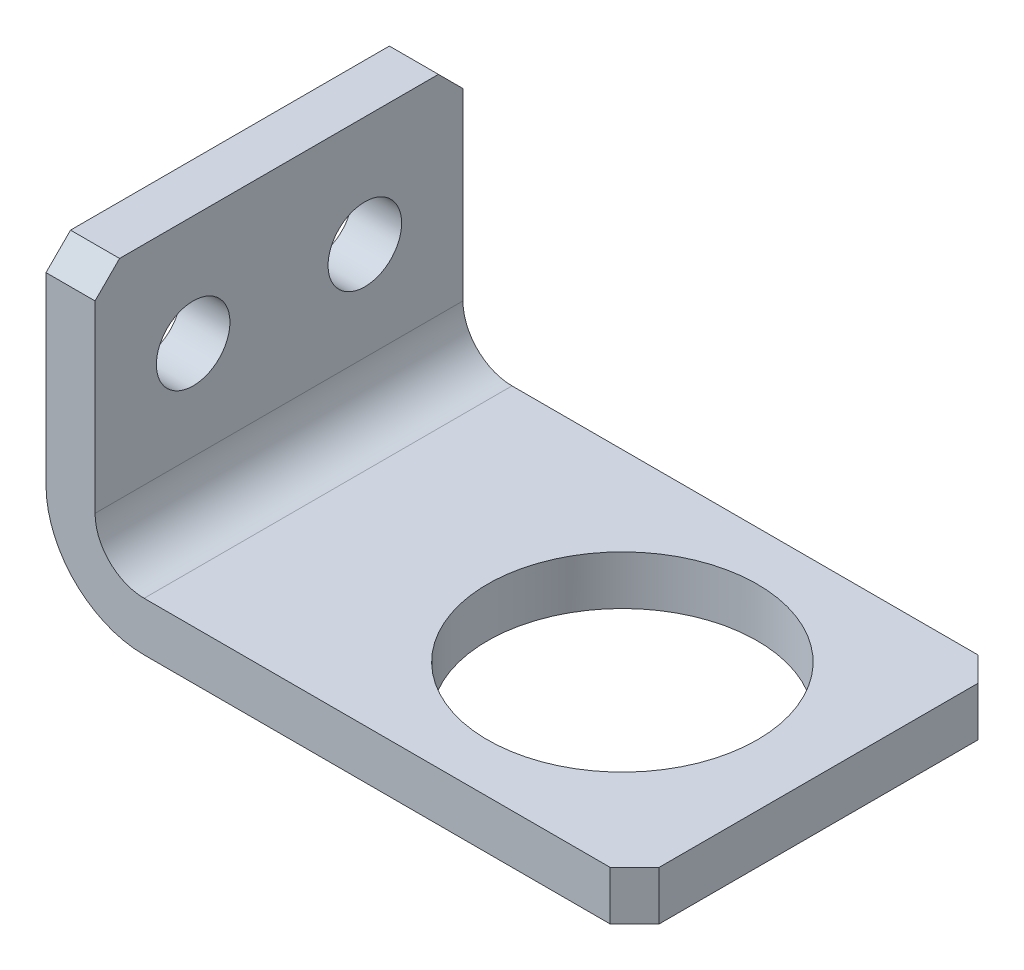
ISO-10303-21;
HEADER;
FILE_DESCRIPTION(('STEP AP214'),'2;1');
FILE_NAME('part.step','',(''),(''),'','','');
FILE_SCHEMA(('AUTOMOTIVE_DESIGN { 1 0 10303 214 1 1 1 1 }'));
ENDSEC;
DATA;
#1=APPLICATION_CONTEXT('core data for automotive mechanical design processes');
#2=APPLICATION_PROTOCOL_DEFINITION('international standard','automotive_design',2000,#1);
#3=PRODUCT_CONTEXT('',#1,'mechanical');
#4=PRODUCT('Part','Part','',(#3));
#5=PRODUCT_RELATED_PRODUCT_CATEGORY('part','',(#4));
#6=PRODUCT_DEFINITION_FORMATION('','',#4);
#7=PRODUCT_DEFINITION_CONTEXT('part definition',#1,'design');
#8=PRODUCT_DEFINITION('design','',#6,#7);
#9=PRODUCT_DEFINITION_SHAPE('','',#8);
#10=(LENGTH_UNIT() NAMED_UNIT(*) SI_UNIT(.MILLI.,.METRE.));
#11=(NAMED_UNIT(*) PLANE_ANGLE_UNIT() SI_UNIT($,.RADIAN.));
#12=(NAMED_UNIT(*) SI_UNIT($,.STERADIAN.) SOLID_ANGLE_UNIT());
#13=UNCERTAINTY_MEASURE_WITH_UNIT(LENGTH_MEASURE(1.E-05),#10,'distance_accuracy_value','');
#14=(GEOMETRIC_REPRESENTATION_CONTEXT(3) GLOBAL_UNCERTAINTY_ASSIGNED_CONTEXT((#13)) GLOBAL_UNIT_ASSIGNED_CONTEXT((#10,
#11,#12)) REPRESENTATION_CONTEXT('',''));
#15=CARTESIAN_POINT('',(0.,0.,0.));
#16=DIRECTION('',(0.,0.,1.));
#17=DIRECTION('',(1.,0.,0.));
#18=AXIS2_PLACEMENT_3D('',#15,#16,#17);
#19=CARTESIAN_POINT('',(0.,25.,13.));
#20=DIRECTION('',(0.,0.707106781186547,0.707106781186548));
#21=DIRECTION('',(-1.,0.,0.));
#22=AXIS2_PLACEMENT_3D('',#19,#20,#21);
#23=PLANE('',#22);
#24=DIRECTION('',(1.,0.,0.));
#25=VECTOR('',#24,1.);
#26=CARTESIAN_POINT('',(-24.,25.,13.));
#27=LINE('',#26,#25);
#28=CARTESIAN_POINT('',(-24.,25.,13.));
#29=VERTEX_POINT('',#28);
#30=CARTESIAN_POINT('',(-20.,25.,13.));
#31=VERTEX_POINT('',#30);
#32=EDGE_CURVE('E269',#29,#31,#27,.T.);
#33=ORIENTED_EDGE('',*,*,#32,.F.);
#34=DIRECTION('',(0.,0.707106781186548,-0.707106781186547));
#35=VECTOR('',#34,1.);
#36=CARTESIAN_POINT('',(-24.,25.,13.));
#37=LINE('',#36,#35);
#38=CARTESIAN_POINT('',(-24.,23.,15.));
#39=VERTEX_POINT('',#38);
#40=EDGE_CURVE('E79',#39,#29,#37,.T.);
#41=ORIENTED_EDGE('',*,*,#40,.F.);
#42=DIRECTION('',(-1.,0.,0.));
#43=VECTOR('',#42,1.);
#44=CARTESIAN_POINT('',(-24.,23.,15.));
#45=LINE('',#44,#43);
#46=CARTESIAN_POINT('',(-20.,23.,15.));
#47=VERTEX_POINT('',#46);
#48=EDGE_CURVE('E272',#47,#39,#45,.T.);
#49=ORIENTED_EDGE('',*,*,#48,.F.);
#50=DIRECTION('',(0.,-0.707106781186548,0.707106781186547));
#51=VECTOR('',#50,1.);
#52=CARTESIAN_POINT('',(-20.,26.5,11.5));
#53=LINE('',#52,#51);
#54=EDGE_CURVE('E13',#31,#47,#53,.T.);
#55=ORIENTED_EDGE('',*,*,#54,.F.);
#56=EDGE_LOOP('',(#33,#41,#49,#55));
#57=FACE_BOUND('',#56,.T.);
#58=ADVANCED_FACE('F71',(#57),#23,.T.);
#59=CARTESIAN_POINT('',(0.,25.,-13.));
#60=DIRECTION('',(0.,0.707106781186548,-0.707106781186547));
#61=DIRECTION('',(1.,0.,0.));
#62=AXIS2_PLACEMENT_3D('',#59,#60,#61);
#63=PLANE('',#62);
#64=DIRECTION('',(-1.,0.,0.));
#65=VECTOR('',#64,1.);
#66=CARTESIAN_POINT('',(-20.,25.,-13.));
#67=LINE('',#66,#65);
#68=CARTESIAN_POINT('',(-20.,25.,-13.));
#69=VERTEX_POINT('',#68);
#70=CARTESIAN_POINT('',(-24.,25.,-13.));
#71=VERTEX_POINT('',#70);
#72=EDGE_CURVE('E261',#69,#71,#67,.T.);
#73=ORIENTED_EDGE('',*,*,#72,.F.);
#74=DIRECTION('',(0.,0.707106781186547,0.707106781186548));
#75=VECTOR('',#74,1.);
#76=CARTESIAN_POINT('',(-20.,11.5,-26.5));
#77=LINE('',#76,#75);
#78=CARTESIAN_POINT('',(-20.,23.,-15.));
#79=VERTEX_POINT('',#78);
#80=EDGE_CURVE('E266',#79,#69,#77,.T.);
#81=ORIENTED_EDGE('',*,*,#80,.F.);
#82=DIRECTION('',(1.,0.,0.));
#83=VECTOR('',#82,1.);
#84=CARTESIAN_POINT('',(-20.,23.,-15.));
#85=LINE('',#84,#83);
#86=CARTESIAN_POINT('',(-24.,23.,-15.));
#87=VERTEX_POINT('',#86);
#88=EDGE_CURVE('E264',#87,#79,#85,.T.);
#89=ORIENTED_EDGE('',*,*,#88,.F.);
#90=DIRECTION('',(0.,-0.707106781186547,-0.707106781186548));
#91=VECTOR('',#90,1.);
#92=CARTESIAN_POINT('',(-24.,25.,-13.));
#93=LINE('',#92,#91);
#94=EDGE_CURVE('E165',#71,#87,#93,.T.);
#95=ORIENTED_EDGE('',*,*,#94,.F.);
#96=EDGE_LOOP('',(#73,#81,#89,#95));
#97=FACE_BOUND('',#96,.T.);
#98=ADVANCED_FACE('F278',(#97),#63,.T.);
#99=CARTESIAN_POINT('',(24.,25.,13.));
#100=DIRECTION('',(-0.707106781186547,0.,-0.707106781186547));
#101=DIRECTION('',(0.,-1.,0.));
#102=AXIS2_PLACEMENT_3D('',#99,#100,#101);
#103=PLANE('',#102);
#104=DIRECTION('',(0.,-1.,0.));
#105=VECTOR('',#104,1.);
#106=CARTESIAN_POINT('',(24.,25.,13.));
#107=LINE('',#106,#105);
#108=CARTESIAN_POINT('',(24.,4.,13.));
#109=VERTEX_POINT('',#108);
#110=CARTESIAN_POINT('',(24.,0.,13.));
#111=VERTEX_POINT('',#110);
#112=EDGE_CURVE('E251',#109,#111,#107,.T.);
#113=ORIENTED_EDGE('',*,*,#112,.F.);
#114=DIRECTION('',(-0.707106781186548,0.,0.707106781186548));
#115=VECTOR('',#114,1.);
#116=CARTESIAN_POINT('',(24.,4.,13.));
#117=LINE('',#116,#115);
#118=CARTESIAN_POINT('',(22.,4.,15.));
#119=VERTEX_POINT('',#118);
#120=EDGE_CURVE('E257',#119,#109,#117,.F.);
#121=ORIENTED_EDGE('',*,*,#120,.F.);
#122=DIRECTION('',(0.,1.,0.));
#123=VECTOR('',#122,1.);
#124=CARTESIAN_POINT('',(22.,25.,15.));
#125=LINE('',#124,#123);
#126=CARTESIAN_POINT('',(22.,0.,15.));
#127=VERTEX_POINT('',#126);
#128=EDGE_CURVE('E254',#127,#119,#125,.T.);
#129=ORIENTED_EDGE('',*,*,#128,.F.);
#130=DIRECTION('',(0.707106781186548,0.,-0.707106781186548));
#131=VECTOR('',#130,1.);
#132=CARTESIAN_POINT('',(24.,0.,13.));
#133=LINE('',#132,#131);
#134=EDGE_CURVE('E259',#111,#127,#133,.F.);
#135=ORIENTED_EDGE('',*,*,#134,.F.);
#136=EDGE_LOOP('',(#113,#121,#129,#135));
#137=FACE_BOUND('',#136,.T.);
#138=ADVANCED_FACE('F304',(#137),#103,.F.);
#139=CARTESIAN_POINT('',(24.,25.,-13.));
#140=DIRECTION('',(-0.707106781186547,0.,0.707106781186548));
#141=DIRECTION('',(0.,1.,0.));
#142=AXIS2_PLACEMENT_3D('',#139,#140,#141);
#143=PLANE('',#142);
#144=DIRECTION('',(0.,1.,0.));
#145=VECTOR('',#144,1.);
#146=CARTESIAN_POINT('',(24.,25.,-13.));
#147=LINE('',#146,#145);
#148=CARTESIAN_POINT('',(24.,0.,-13.));
#149=VERTEX_POINT('',#148);
#150=CARTESIAN_POINT('',(24.,4.,-13.));
#151=VERTEX_POINT('',#150);
#152=EDGE_CURVE('E231',#149,#151,#147,.T.);
#153=ORIENTED_EDGE('',*,*,#152,.F.);
#154=DIRECTION('',(-0.707106781186548,0.,-0.707106781186547));
#155=VECTOR('',#154,1.);
#156=CARTESIAN_POINT('',(24.,0.,-13.));
#157=LINE('',#156,#155);
#158=CARTESIAN_POINT('',(22.,0.,-15.));
#159=VERTEX_POINT('',#158);
#160=EDGE_CURVE('E246',#159,#149,#157,.F.);
#161=ORIENTED_EDGE('',*,*,#160,.F.);
#162=DIRECTION('',(0.,-1.,0.));
#163=VECTOR('',#162,1.);
#164=CARTESIAN_POINT('',(22.,25.,-15.));
#165=LINE('',#164,#163);
#166=CARTESIAN_POINT('',(22.,4.,-15.));
#167=VERTEX_POINT('',#166);
#168=EDGE_CURVE('E244',#167,#159,#165,.T.);
#169=ORIENTED_EDGE('',*,*,#168,.F.);
#170=DIRECTION('',(0.707106781186548,0.,0.707106781186547));
#171=VECTOR('',#170,1.);
#172=CARTESIAN_POINT('',(24.,4.,-13.));
#173=LINE('',#172,#171);
#174=EDGE_CURVE('E249',#151,#167,#173,.F.);
#175=ORIENTED_EDGE('',*,*,#174,.F.);
#176=EDGE_LOOP('',(#153,#161,#169,#175));
#177=FACE_BOUND('',#176,.T.);
#178=ADVANCED_FACE('F293',(#177),#143,.F.);
#179=CARTESIAN_POINT('',(-24.,25.,15.));
#180=DIRECTION('',(1.,0.,0.));
#181=DIRECTION('',(0.,0.,-1.));
#182=AXIS2_PLACEMENT_3D('',#179,#180,#181);
#183=PLANE('',#182);
#184=CARTESIAN_POINT('',(-24.,16.,7.));
#185=DIRECTION('',(1.,0.,0.));
#186=DIRECTION('',(0.,0.,-1.));
#187=AXIS2_PLACEMENT_3D('',#184,#185,#186);
#188=CIRCLE('',#187,3.);
#189=CARTESIAN_POINT('',(-24.,16.,4.));
#190=VERTEX_POINT('',#189);
#191=EDGE_CURVE('E191',#190,#190,#188,.T.);
#192=ORIENTED_EDGE('',*,*,#191,.T.);
#193=EDGE_LOOP('',(#192));
#194=FACE_BOUND('',#193,.T.);
#195=DIRECTION('',(0.,-1.,0.));
#196=VECTOR('',#195,1.);
#197=CARTESIAN_POINT('',(-24.,25.,15.));
#198=LINE('',#197,#196);
#199=CARTESIAN_POINT('',(-24.,8.,15.));
#200=VERTEX_POINT('',#199);
#201=EDGE_CURVE('E170',#39,#200,#198,.T.);
#202=ORIENTED_EDGE('',*,*,#201,.F.);
#203=ORIENTED_EDGE('',*,*,#40,.T.);
#204=DIRECTION('',(0.,0.,1.));
#205=VECTOR('',#204,1.);
#206=CARTESIAN_POINT('',(-24.,25.,15.));
#207=LINE('',#206,#205);
#208=EDGE_CURVE('E171',#71,#29,#207,.T.);
#209=ORIENTED_EDGE('',*,*,#208,.F.);
#210=ORIENTED_EDGE('',*,*,#94,.T.);
#211=DIRECTION('',(0.,-1.,0.));
#212=VECTOR('',#211,1.);
#213=CARTESIAN_POINT('',(-24.,25.,-15.));
#214=LINE('',#213,#212);
#215=CARTESIAN_POINT('',(-24.,8.,-15.));
#216=VERTEX_POINT('',#215);
#217=EDGE_CURVE('E158',#87,#216,#214,.T.);
#218=ORIENTED_EDGE('',*,*,#217,.T.);
#219=DIRECTION('',(0.,0.,1.));
#220=VECTOR('',#219,1.);
#221=CARTESIAN_POINT('',(-24.,8.,-15.));
#222=LINE('',#221,#220);
#223=EDGE_CURVE('E163',#216,#200,#222,.T.);
#224=ORIENTED_EDGE('',*,*,#223,.T.);
#225=EDGE_LOOP('',(#202,#203,#209,#210,#218,#224));
#226=FACE_BOUND('',#225,.T.);
#227=CARTESIAN_POINT('',(-24.,16.,-7.));
#228=DIRECTION('',(-1.,0.,0.));
#229=DIRECTION('',(0.,0.,1.));
#230=AXIS2_PLACEMENT_3D('',#227,#228,#229);
#231=CIRCLE('',#230,3.);
#232=CARTESIAN_POINT('',(-24.,16.,-4.));
#233=VERTEX_POINT('',#232);
#234=EDGE_CURVE('E235',#233,#233,#231,.T.);
#235=ORIENTED_EDGE('',*,*,#234,.F.);
#236=EDGE_LOOP('',(#235));
#237=FACE_BOUND('',#236,.T.);
#238=ADVANCED_FACE('F161',(#194,#226,#237),#183,.F.);
#239=CARTESIAN_POINT('',(-20.,0.,-15.));
#240=DIRECTION('',(1.,0.,0.));
#241=DIRECTION('',(0.,0.,-1.));
#242=AXIS2_PLACEMENT_3D('',#239,#240,#241);
#243=PLANE('',#242);
#244=DIRECTION('',(0.,0.,1.));
#245=VECTOR('',#244,1.);
#246=CARTESIAN_POINT('',(-20.,25.,-15.));
#247=LINE('',#246,#245);
#248=EDGE_CURVE('E214',#69,#31,#247,.T.);
#249=ORIENTED_EDGE('',*,*,#248,.T.);
#250=ORIENTED_EDGE('',*,*,#54,.T.);
#251=DIRECTION('',(0.,1.,0.));
#252=VECTOR('',#251,1.);
#253=CARTESIAN_POINT('',(-20.,0.,15.));
#254=LINE('',#253,#252);
#255=CARTESIAN_POINT('',(-20.,8.,15.));
#256=VERTEX_POINT('',#255);
#257=EDGE_CURVE('E194',#256,#47,#254,.T.);
#258=ORIENTED_EDGE('',*,*,#257,.F.);
#259=DIRECTION('',(0.,0.,1.));
#260=VECTOR('',#259,1.);
#261=CARTESIAN_POINT('',(-20.,8.,-15.));
#262=LINE('',#261,#260);
#263=CARTESIAN_POINT('',(-20.,8.,-15.));
#264=VERTEX_POINT('',#263);
#265=EDGE_CURVE('E206',#264,#256,#262,.T.);
#266=ORIENTED_EDGE('',*,*,#265,.F.);
#267=DIRECTION('',(0.,1.,0.));
#268=VECTOR('',#267,1.);
#269=CARTESIAN_POINT('',(-20.,0.,-15.));
#270=LINE('',#269,#268);
#271=EDGE_CURVE('E196',#264,#79,#270,.T.);
#272=ORIENTED_EDGE('',*,*,#271,.T.);
#273=ORIENTED_EDGE('',*,*,#80,.T.);
#274=EDGE_LOOP('',(#249,#250,#258,#266,#272,#273));
#275=FACE_BOUND('',#274,.T.);
#276=CARTESIAN_POINT('',(-20.,16.,7.));
#277=DIRECTION('',(1.,0.,0.));
#278=DIRECTION('',(0.,0.,-1.));
#279=AXIS2_PLACEMENT_3D('',#276,#277,#278);
#280=CIRCLE('',#279,3.);
#281=CARTESIAN_POINT('',(-20.,16.,4.));
#282=VERTEX_POINT('',#281);
#283=EDGE_CURVE('E232',#282,#282,#280,.T.);
#284=ORIENTED_EDGE('',*,*,#283,.F.);
#285=EDGE_LOOP('',(#284));
#286=FACE_BOUND('',#285,.T.);
#287=CARTESIAN_POINT('',(-20.,16.,-7.));
#288=DIRECTION('',(1.,0.,0.));
#289=DIRECTION('',(0.,0.,-1.));
#290=AXIS2_PLACEMENT_3D('',#287,#288,#289);
#291=CIRCLE('',#290,3.);
#292=CARTESIAN_POINT('',(-20.,16.,-10.));
#293=VERTEX_POINT('',#292);
#294=EDGE_CURVE('E188',#293,#293,#291,.F.);
#295=ORIENTED_EDGE('',*,*,#294,.T.);
#296=EDGE_LOOP('',(#295));
#297=FACE_BOUND('',#296,.T.);
#298=ADVANCED_FACE('F280',(#275,#286,#297),#243,.T.);
#299=CARTESIAN_POINT('',(24.,25.,15.));
#300=DIRECTION('',(0.,0.,-1.));
#301=DIRECTION('',(-1.,0.,0.));
#302=AXIS2_PLACEMENT_3D('',#299,#300,#301);
#303=PLANE('',#302);
#304=ORIENTED_EDGE('',*,*,#257,.T.);
#305=ORIENTED_EDGE('',*,*,#48,.T.);
#306=ORIENTED_EDGE('',*,*,#201,.T.);
#307=CARTESIAN_POINT('',(-16.,8.,15.));
#308=DIRECTION('',(0.,0.,1.));
#309=DIRECTION('',(1.,0.,0.));
#310=AXIS2_PLACEMENT_3D('',#307,#308,#309);
#311=CIRCLE('',#310,8.);
#312=CARTESIAN_POINT('',(-16.,0.,15.));
#313=VERTEX_POINT('',#312);
#314=EDGE_CURVE('E180',#200,#313,#311,.T.);
#315=ORIENTED_EDGE('',*,*,#314,.T.);
#316=DIRECTION('',(1.,0.,0.));
#317=VECTOR('',#316,1.);
#318=CARTESIAN_POINT('',(24.,0.,15.));
#319=LINE('',#318,#317);
#320=EDGE_CURVE('E216',#313,#127,#319,.T.);
#321=ORIENTED_EDGE('',*,*,#320,.T.);
#322=ORIENTED_EDGE('',*,*,#128,.T.);
#323=DIRECTION('',(1.,0.,0.));
#324=VECTOR('',#323,1.);
#325=CARTESIAN_POINT('',(0.,4.,15.));
#326=LINE('',#325,#324);
#327=CARTESIAN_POINT('',(-16.,4.,15.));
#328=VERTEX_POINT('',#327);
#329=EDGE_CURVE('E200',#328,#119,#326,.T.);
#330=ORIENTED_EDGE('',*,*,#329,.F.);
#331=CARTESIAN_POINT('',(-16.,8.,15.));
#332=DIRECTION('',(0.,0.,1.));
#333=DIRECTION('',(1.,0.,0.));
#334=AXIS2_PLACEMENT_3D('',#331,#332,#333);
#335=CIRCLE('',#334,4.);
#336=EDGE_CURVE('E209',#256,#328,#335,.T.);
#337=ORIENTED_EDGE('',*,*,#336,.F.);
#338=EDGE_LOOP('',(#304,#305,#306,#315,#321,#322,#330,#337));
#339=FACE_BOUND('',#338,.T.);
#340=ADVANCED_FACE('F299',(#339),#303,.F.);
#341=CARTESIAN_POINT('',(24.,25.,-15.));
#342=DIRECTION('',(0.,0.,1.));
#343=DIRECTION('',(1.,0.,0.));
#344=AXIS2_PLACEMENT_3D('',#341,#342,#343);
#345=PLANE('',#344);
#346=ORIENTED_EDGE('',*,*,#217,.F.);
#347=ORIENTED_EDGE('',*,*,#88,.T.);
#348=ORIENTED_EDGE('',*,*,#271,.F.);
#349=CARTESIAN_POINT('',(-16.,8.,-15.));
#350=DIRECTION('',(0.,0.,1.));
#351=DIRECTION('',(1.,0.,0.));
#352=AXIS2_PLACEMENT_3D('',#349,#350,#351);
#353=CIRCLE('',#352,4.);
#354=CARTESIAN_POINT('',(-16.,4.,-15.));
#355=VERTEX_POINT('',#354);
#356=EDGE_CURVE('E199',#264,#355,#353,.T.);
#357=ORIENTED_EDGE('',*,*,#356,.T.);
#358=DIRECTION('',(1.,0.,0.));
#359=VECTOR('',#358,1.);
#360=CARTESIAN_POINT('',(0.,4.,-15.));
#361=LINE('',#360,#359);
#362=EDGE_CURVE('E203',#355,#167,#361,.T.);
#363=ORIENTED_EDGE('',*,*,#362,.T.);
#364=ORIENTED_EDGE('',*,*,#168,.T.);
#365=DIRECTION('',(-1.,0.,0.));
#366=VECTOR('',#365,1.);
#367=CARTESIAN_POINT('',(24.,0.,-15.));
#368=LINE('',#367,#366);
#369=CARTESIAN_POINT('',(-16.,0.,-15.));
#370=VERTEX_POINT('',#369);
#371=EDGE_CURVE('E186',#159,#370,#368,.T.);
#372=ORIENTED_EDGE('',*,*,#371,.T.);
#373=CARTESIAN_POINT('',(-16.,8.,-15.));
#374=DIRECTION('',(0.,0.,1.));
#375=DIRECTION('',(1.,0.,0.));
#376=AXIS2_PLACEMENT_3D('',#373,#374,#375);
#377=CIRCLE('',#376,8.);
#378=EDGE_CURVE('E177',#216,#370,#377,.T.);
#379=ORIENTED_EDGE('',*,*,#378,.F.);
#380=EDGE_LOOP('',(#346,#347,#348,#357,#363,#364,#372,#379));
#381=FACE_BOUND('',#380,.T.);
#382=ADVANCED_FACE('F183',(#381),#345,.F.);
#383=CARTESIAN_POINT('',(0.,25.,0.));
#384=DIRECTION('',(0.,1.,0.));
#385=DIRECTION('',(0.,0.,1.));
#386=AXIS2_PLACEMENT_3D('',#383,#384,#385);
#387=PLANE('',#386);
#388=ORIENTED_EDGE('',*,*,#208,.T.);
#389=ORIENTED_EDGE('',*,*,#32,.T.);
#390=ORIENTED_EDGE('',*,*,#248,.F.);
#391=ORIENTED_EDGE('',*,*,#72,.T.);
#392=EDGE_LOOP('',(#388,#389,#390,#391));
#393=FACE_BOUND('',#392,.T.);
#394=ADVANCED_FACE('F275',(#393),#387,.T.);
#395=CARTESIAN_POINT('',(0.,0.,0.));
#396=DIRECTION('',(0.,1.,0.));
#397=DIRECTION('',(0.,0.,1.));
#398=AXIS2_PLACEMENT_3D('',#395,#396,#397);
#399=PLANE('',#398);
#400=CARTESIAN_POINT('',(8.,0.,0.));
#401=DIRECTION('',(0.,1.,0.));
#402=DIRECTION('',(0.,0.,1.));
#403=AXIS2_PLACEMENT_3D('',#400,#401,#402);
#404=CIRCLE('',#403,11.);
#405=CARTESIAN_POINT('',(8.,0.,11.));
#406=VERTEX_POINT('',#405);
#407=EDGE_CURVE('E241',#406,#406,#404,.T.);
#408=ORIENTED_EDGE('',*,*,#407,.T.);
#409=EDGE_LOOP('',(#408));
#410=FACE_BOUND('',#409,.T.);
#411=DIRECTION('',(0.,0.,-1.));
#412=VECTOR('',#411,1.);
#413=CARTESIAN_POINT('',(24.,0.,15.));
#414=LINE('',#413,#412);
#415=EDGE_CURVE('E227',#111,#149,#414,.T.);
#416=ORIENTED_EDGE('',*,*,#415,.F.);
#417=ORIENTED_EDGE('',*,*,#134,.T.);
#418=ORIENTED_EDGE('',*,*,#320,.F.);
#419=DIRECTION('',(0.,0.,1.));
#420=VECTOR('',#419,1.);
#421=CARTESIAN_POINT('',(-16.,0.,-15.));
#422=LINE('',#421,#420);
#423=EDGE_CURVE('E181',#370,#313,#422,.T.);
#424=ORIENTED_EDGE('',*,*,#423,.F.);
#425=ORIENTED_EDGE('',*,*,#371,.F.);
#426=ORIENTED_EDGE('',*,*,#160,.T.);
#427=EDGE_LOOP('',(#416,#417,#418,#424,#425,#426));
#428=FACE_BOUND('',#427,.T.);
#429=ADVANCED_FACE('F296',(#410,#428),#399,.F.);
#430=CARTESIAN_POINT('',(24.,25.,15.));
#431=DIRECTION('',(-1.,0.,0.));
#432=DIRECTION('',(0.,0.,1.));
#433=AXIS2_PLACEMENT_3D('',#430,#431,#432);
#434=PLANE('',#433);
#435=DIRECTION('',(0.,0.,1.));
#436=VECTOR('',#435,1.);
#437=CARTESIAN_POINT('',(24.,4.,-15.));
#438=LINE('',#437,#436);
#439=EDGE_CURVE('E217',#151,#109,#438,.T.);
#440=ORIENTED_EDGE('',*,*,#439,.T.);
#441=ORIENTED_EDGE('',*,*,#112,.T.);
#442=ORIENTED_EDGE('',*,*,#415,.T.);
#443=ORIENTED_EDGE('',*,*,#152,.T.);
#444=EDGE_LOOP('',(#440,#441,#442,#443));
#445=FACE_BOUND('',#444,.T.);
#446=ADVANCED_FACE('F306',(#445),#434,.F.);
#447=CARTESIAN_POINT('',(-16.,8.,-15.));
#448=DIRECTION('',(0.,0.,1.));
#449=DIRECTION('',(1.,0.,0.));
#450=AXIS2_PLACEMENT_3D('',#447,#448,#449);
#451=CYLINDRICAL_SURFACE('',#450,8.);
#452=ORIENTED_EDGE('',*,*,#314,.F.);
#453=ORIENTED_EDGE('',*,*,#223,.F.);
#454=ORIENTED_EDGE('',*,*,#378,.T.);
#455=ORIENTED_EDGE('',*,*,#423,.T.);
#456=EDGE_LOOP('',(#452,#453,#454,#455));
#457=FACE_BOUND('',#456,.T.);
#458=ADVANCED_FACE('F176',(#457),#451,.T.);
#459=CARTESIAN_POINT('',(0.,4.,-15.));
#460=DIRECTION('',(0.,-1.,0.));
#461=DIRECTION('',(1.,0.,0.));
#462=AXIS2_PLACEMENT_3D('',#459,#460,#461);
#463=PLANE('',#462);
#464=CARTESIAN_POINT('',(8.,4.,0.));
#465=DIRECTION('',(0.,-1.,0.));
#466=DIRECTION('',(1.,0.,0.));
#467=AXIS2_PLACEMENT_3D('',#464,#465,#466);
#468=CIRCLE('',#467,11.);
#469=CARTESIAN_POINT('',(19.,4.,0.));
#470=VERTEX_POINT('',#469);
#471=EDGE_CURVE('E238',#470,#470,#468,.F.);
#472=ORIENTED_EDGE('',*,*,#471,.F.);
#473=EDGE_LOOP('',(#472));
#474=FACE_BOUND('',#473,.T.);
#475=ORIENTED_EDGE('',*,*,#329,.T.);
#476=ORIENTED_EDGE('',*,*,#120,.T.);
#477=ORIENTED_EDGE('',*,*,#439,.F.);
#478=ORIENTED_EDGE('',*,*,#174,.T.);
#479=ORIENTED_EDGE('',*,*,#362,.F.);
#480=DIRECTION('',(0.,0.,1.));
#481=VECTOR('',#480,1.);
#482=CARTESIAN_POINT('',(-16.,4.,-15.));
#483=LINE('',#482,#481);
#484=EDGE_CURVE('E220',#355,#328,#483,.T.);
#485=ORIENTED_EDGE('',*,*,#484,.T.);
#486=EDGE_LOOP('',(#475,#476,#477,#478,#479,#485));
#487=FACE_BOUND('',#486,.T.);
#488=ADVANCED_FACE('F289',(#474,#487),#463,.F.);
#489=CARTESIAN_POINT('',(-16.,8.,-15.));
#490=DIRECTION('',(0.,0.,1.));
#491=DIRECTION('',(1.,0.,0.));
#492=AXIS2_PLACEMENT_3D('',#489,#490,#491);
#493=CYLINDRICAL_SURFACE('',#492,4.);
#494=ORIENTED_EDGE('',*,*,#336,.T.);
#495=ORIENTED_EDGE('',*,*,#484,.F.);
#496=ORIENTED_EDGE('',*,*,#356,.F.);
#497=ORIENTED_EDGE('',*,*,#265,.T.);
#498=EDGE_LOOP('',(#494,#495,#496,#497));
#499=FACE_BOUND('',#498,.T.);
#500=ADVANCED_FACE('F285',(#499),#493,.F.);
#501=CARTESIAN_POINT('',(-24.,16.,7.));
#502=DIRECTION('',(1.,0.,0.));
#503=DIRECTION('',(0.,0.,-1.));
#504=AXIS2_PLACEMENT_3D('',#501,#502,#503);
#505=CYLINDRICAL_SURFACE('',#504,3.);
#506=ORIENTED_EDGE('',*,*,#283,.T.);
#507=EDGE_LOOP('',(#506));
#508=FACE_BOUND('',#507,.T.);
#509=ORIENTED_EDGE('',*,*,#191,.F.);
#510=EDGE_LOOP('',(#509));
#511=FACE_BOUND('',#510,.T.);
#512=ADVANCED_FACE('F418',(#508,#511),#505,.F.);
#513=CARTESIAN_POINT('',(-24.,16.,-7.));
#514=DIRECTION('',(1.,0.,0.));
#515=DIRECTION('',(0.,0.,-1.));
#516=AXIS2_PLACEMENT_3D('',#513,#514,#515);
#517=CYLINDRICAL_SURFACE('',#516,3.);
#518=ORIENTED_EDGE('',*,*,#294,.F.);
#519=EDGE_LOOP('',(#518));
#520=FACE_BOUND('',#519,.T.);
#521=ORIENTED_EDGE('',*,*,#234,.T.);
#522=EDGE_LOOP('',(#521));
#523=FACE_BOUND('',#522,.T.);
#524=ADVANCED_FACE('F425',(#520,#523),#517,.F.);
#525=CARTESIAN_POINT('',(8.,25.,0.));
#526=DIRECTION('',(0.,-1.,0.));
#527=DIRECTION('',(0.,0.,-1.));
#528=AXIS2_PLACEMENT_3D('',#525,#526,#527);
#529=CYLINDRICAL_SURFACE('',#528,11.);
#530=ORIENTED_EDGE('',*,*,#407,.F.);
#531=EDGE_LOOP('',(#530));
#532=FACE_BOUND('',#531,.T.);
#533=ORIENTED_EDGE('',*,*,#471,.T.);
#534=EDGE_LOOP('',(#533));
#535=FACE_BOUND('',#534,.T.);
#536=ADVANCED_FACE('F435',(#532,#535),#529,.F.);
#537=CLOSED_SHELL('',(#58,#98,#138,#178,#238,#298,#340,#382,#394,#429,#446,#458,#488,#500,#512,
#524,#536));
#538=MANIFOLD_SOLID_BREP('B2',#537);
#539=ADVANCED_BREP_SHAPE_REPRESENTATION('',(#18,#538),#14);
#540=SHAPE_DEFINITION_REPRESENTATION(#9,#539);
ENDSEC;
END-ISO-10303-21;
